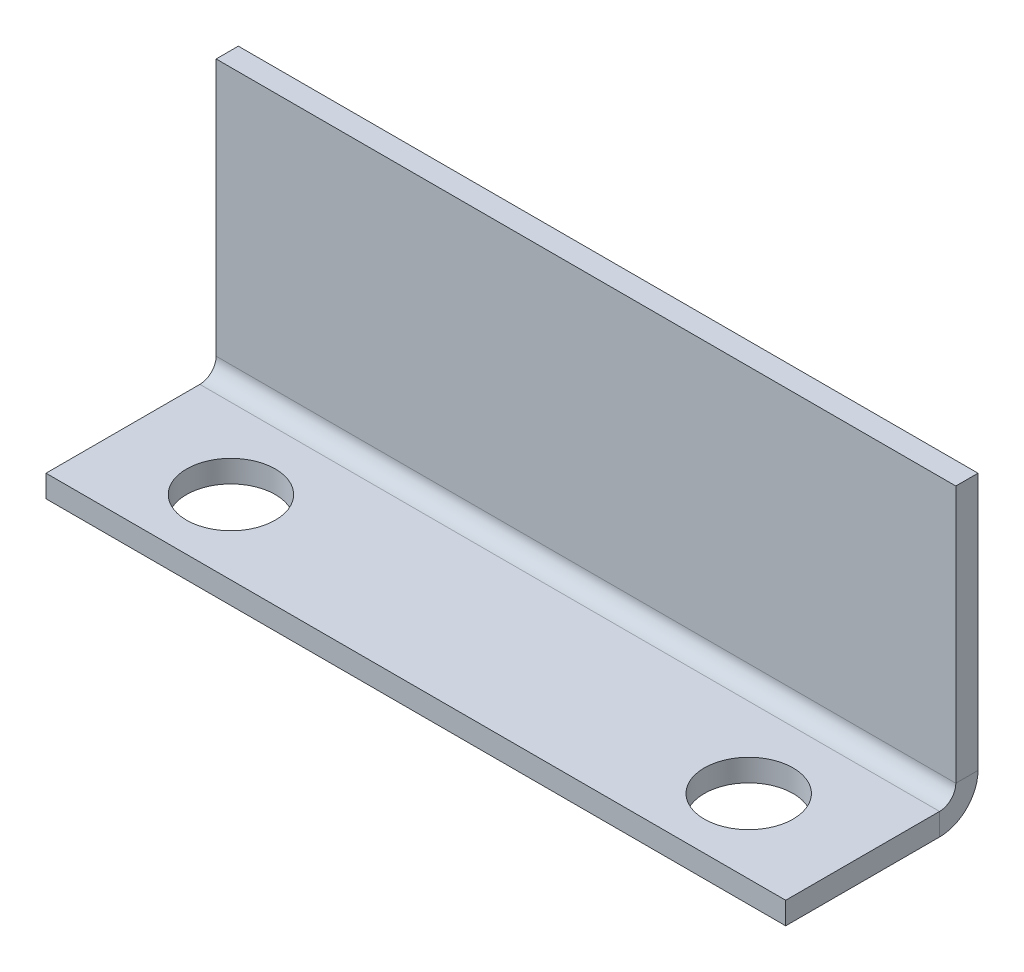
ISO-10303-21;
HEADER;
FILE_DESCRIPTION(('STEP AP214'),'2;1');
FILE_NAME('part.step','',(''),(''),'','','');
FILE_SCHEMA(('AUTOMOTIVE_DESIGN { 1 0 10303 214 1 1 1 1 }'));
ENDSEC;
DATA;
#1=APPLICATION_CONTEXT('core data for automotive mechanical design processes');
#2=APPLICATION_PROTOCOL_DEFINITION('international standard','automotive_design',2000,#1);
#3=PRODUCT_CONTEXT('',#1,'mechanical');
#4=PRODUCT('Part','Part','',(#3));
#5=PRODUCT_RELATED_PRODUCT_CATEGORY('part','',(#4));
#6=PRODUCT_DEFINITION_FORMATION('','',#4);
#7=PRODUCT_DEFINITION_CONTEXT('part definition',#1,'design');
#8=PRODUCT_DEFINITION('design','',#6,#7);
#9=PRODUCT_DEFINITION_SHAPE('','',#8);
#10=(LENGTH_UNIT() NAMED_UNIT(*) SI_UNIT(.MILLI.,.METRE.));
#11=(NAMED_UNIT(*) PLANE_ANGLE_UNIT() SI_UNIT($,.RADIAN.));
#12=(NAMED_UNIT(*) SI_UNIT($,.STERADIAN.) SOLID_ANGLE_UNIT());
#13=UNCERTAINTY_MEASURE_WITH_UNIT(LENGTH_MEASURE(1.E-05),#10,'distance_accuracy_value','');
#14=(GEOMETRIC_REPRESENTATION_CONTEXT(3) GLOBAL_UNCERTAINTY_ASSIGNED_CONTEXT((#13)) GLOBAL_UNIT_ASSIGNED_CONTEXT((#10,
#11,#12)) REPRESENTATION_CONTEXT('',''));
#15=CARTESIAN_POINT('',(0.,0.,0.));
#16=DIRECTION('',(0.,0.,1.));
#17=DIRECTION('',(1.,0.,0.));
#18=AXIS2_PLACEMENT_3D('',#15,#16,#17);
#19=CARTESIAN_POINT('',(0.,0.,3.));
#20=DIRECTION('',(1.,0.,0.));
#21=DIRECTION('',(0.,0.,-1.));
#22=AXIS2_PLACEMENT_3D('',#19,#20,#21);
#23=PLANE('',#22);
#24=DIRECTION('',(0.,0.,-1.));
#25=VECTOR('',#24,1.);
#26=CARTESIAN_POINT('',(0.,5.19999999999999,3.));
#27=LINE('',#26,#25);
#28=CARTESIAN_POINT('',(0.,5.19999999999999,3.));
#29=VERTEX_POINT('',#28);
#30=CARTESIAN_POINT('',(0.,5.20000000000001,0.));
#31=VERTEX_POINT('',#30);
#32=EDGE_CURVE('E110',#29,#31,#27,.T.);
#33=ORIENTED_EDGE('',*,*,#32,.F.);
#34=DIRECTION('',(0.,-1.,0.));
#35=VECTOR('',#34,1.);
#36=CARTESIAN_POINT('',(0.,0.,3.));
#37=LINE('',#36,#35);
#38=CARTESIAN_POINT('',(0.,40.,3.));
#39=VERTEX_POINT('',#38);
#40=EDGE_CURVE('E99',#39,#29,#37,.T.);
#41=ORIENTED_EDGE('',*,*,#40,.F.);
#42=DIRECTION('',(0.,0.,-1.));
#43=VECTOR('',#42,1.);
#44=CARTESIAN_POINT('',(0.,40.,3.));
#45=LINE('',#44,#43);
#46=CARTESIAN_POINT('',(0.,40.,0.));
#47=VERTEX_POINT('',#46);
#48=EDGE_CURVE('E62',#39,#47,#45,.T.);
#49=ORIENTED_EDGE('',*,*,#48,.T.);
#50=DIRECTION('',(0.,-1.,0.));
#51=VECTOR('',#50,1.);
#52=CARTESIAN_POINT('',(0.,0.,0.));
#53=LINE('',#52,#51);
#54=EDGE_CURVE('E105',#47,#31,#53,.T.);
#55=ORIENTED_EDGE('',*,*,#54,.T.);
#56=EDGE_LOOP('',(#33,#41,#49,#55));
#57=FACE_BOUND('',#56,.T.);
#58=ADVANCED_FACE('F54',(#57),#23,.F.);
#59=CARTESIAN_POINT('',(100.,0.,3.));
#60=DIRECTION('',(-1.,0.,0.));
#61=DIRECTION('',(0.,0.,1.));
#62=AXIS2_PLACEMENT_3D('',#59,#60,#61);
#63=PLANE('',#62);
#64=DIRECTION('',(0.,0.,-1.));
#65=VECTOR('',#64,1.);
#66=CARTESIAN_POINT('',(100.,5.19999999999999,3.));
#67=LINE('',#66,#65);
#68=CARTESIAN_POINT('',(100.,5.19999999999999,3.));
#69=VERTEX_POINT('',#68);
#70=CARTESIAN_POINT('',(100.,5.19999999999999,0.));
#71=VERTEX_POINT('',#70);
#72=EDGE_CURVE('E113',#69,#71,#67,.T.);
#73=ORIENTED_EDGE('',*,*,#72,.T.);
#74=DIRECTION('',(0.,1.,0.));
#75=VECTOR('',#74,1.);
#76=CARTESIAN_POINT('',(100.,0.,0.));
#77=LINE('',#76,#75);
#78=CARTESIAN_POINT('',(100.,40.,0.));
#79=VERTEX_POINT('',#78);
#80=EDGE_CURVE('E100',#71,#79,#77,.T.);
#81=ORIENTED_EDGE('',*,*,#80,.T.);
#82=DIRECTION('',(0.,0.,-1.));
#83=VECTOR('',#82,1.);
#84=CARTESIAN_POINT('',(100.,40.,3.));
#85=LINE('',#84,#83);
#86=CARTESIAN_POINT('',(100.,40.,3.));
#87=VERTEX_POINT('',#86);
#88=EDGE_CURVE('E13',#87,#79,#85,.T.);
#89=ORIENTED_EDGE('',*,*,#88,.F.);
#90=DIRECTION('',(0.,1.,0.));
#91=VECTOR('',#90,1.);
#92=CARTESIAN_POINT('',(100.,0.,3.));
#93=LINE('',#92,#91);
#94=EDGE_CURVE('E181',#69,#87,#93,.T.);
#95=ORIENTED_EDGE('',*,*,#94,.F.);
#96=EDGE_LOOP('',(#73,#81,#89,#95));
#97=FACE_BOUND('',#96,.T.);
#98=ADVANCED_FACE('F187',(#97),#63,.F.);
#99=CARTESIAN_POINT('',(0.,40.,3.));
#100=DIRECTION('',(0.,0.,-1.));
#101=DIRECTION('',(-1.,0.,0.));
#102=AXIS2_PLACEMENT_3D('',#99,#100,#101);
#103=PLANE('',#102);
#104=DIRECTION('',(1.,0.,0.));
#105=VECTOR('',#104,1.);
#106=CARTESIAN_POINT('',(100.,5.19999999999999,3.));
#107=LINE('',#106,#105);
#108=EDGE_CURVE('E174',#69,#29,#107,.F.);
#109=ORIENTED_EDGE('',*,*,#108,.F.);
#110=ORIENTED_EDGE('',*,*,#94,.T.);
#111=DIRECTION('',(-1.,0.,0.));
#112=VECTOR('',#111,1.);
#113=CARTESIAN_POINT('',(0.,40.,3.));
#114=LINE('',#113,#112);
#115=EDGE_CURVE('E79',#87,#39,#114,.T.);
#116=ORIENTED_EDGE('',*,*,#115,.T.);
#117=ORIENTED_EDGE('',*,*,#40,.T.);
#118=EDGE_LOOP('',(#109,#110,#116,#117));
#119=FACE_BOUND('',#118,.T.);
#120=ADVANCED_FACE('F184',(#119),#103,.F.);
#121=CARTESIAN_POINT('',(0.,40.,0.));
#122=DIRECTION('',(0.,0.,-1.));
#123=DIRECTION('',(-1.,0.,0.));
#124=AXIS2_PLACEMENT_3D('',#121,#122,#123);
#125=PLANE('',#124);
#126=ORIENTED_EDGE('',*,*,#80,.F.);
#127=DIRECTION('',(1.,0.,0.));
#128=VECTOR('',#127,1.);
#129=CARTESIAN_POINT('',(100.,5.19999999999999,0.));
#130=LINE('',#129,#128);
#131=EDGE_CURVE('E109',#71,#31,#130,.F.);
#132=ORIENTED_EDGE('',*,*,#131,.T.);
#133=ORIENTED_EDGE('',*,*,#54,.F.);
#134=DIRECTION('',(-1.,0.,0.));
#135=VECTOR('',#134,1.);
#136=CARTESIAN_POINT('',(0.,40.,0.));
#137=LINE('',#136,#135);
#138=EDGE_CURVE('E91',#79,#47,#137,.T.);
#139=ORIENTED_EDGE('',*,*,#138,.F.);
#140=EDGE_LOOP('',(#126,#132,#133,#139));
#141=FACE_BOUND('',#140,.T.);
#142=ADVANCED_FACE('F108',(#141),#125,.T.);
#143=CARTESIAN_POINT('',(0.,40.,3.));
#144=DIRECTION('',(0.,-1.,0.));
#145=DIRECTION('',(0.,0.,-1.));
#146=AXIS2_PLACEMENT_3D('',#143,#144,#145);
#147=PLANE('',#146);
#148=ORIENTED_EDGE('',*,*,#138,.T.);
#149=ORIENTED_EDGE('',*,*,#48,.F.);
#150=ORIENTED_EDGE('',*,*,#115,.F.);
#151=ORIENTED_EDGE('',*,*,#88,.T.);
#152=EDGE_LOOP('',(#148,#149,#150,#151));
#153=FACE_BOUND('',#152,.T.);
#154=ADVANCED_FACE('F93',(#153),#147,.F.);
#155=CARTESIAN_POINT('',(0.,5.19999999999999,5.2));
#156=DIRECTION('',(-1.,0.,0.));
#157=DIRECTION('',(0.,0.,1.));
#158=AXIS2_PLACEMENT_3D('',#155,#156,#157);
#159=PLANE('',#158);
#160=DIRECTION('',(0.,1.,0.));
#161=VECTOR('',#160,1.);
#162=CARTESIAN_POINT('',(0.,0.,5.19999999999998));
#163=LINE('',#162,#161);
#164=CARTESIAN_POINT('',(0.,2.99999999999999,5.19999999999999));
#165=VERTEX_POINT('',#164);
#166=CARTESIAN_POINT('',(0.,0.,5.19999999999998));
#167=VERTEX_POINT('',#166);
#168=EDGE_CURVE('E119',#165,#167,#163,.F.);
#169=ORIENTED_EDGE('',*,*,#168,.F.);
#170=CARTESIAN_POINT('',(0.,5.19999999999999,5.2));
#171=DIRECTION('',(1.,0.,0.));
#172=DIRECTION('',(0.,0.,-1.));
#173=AXIS2_PLACEMENT_3D('',#170,#171,#172);
#174=CIRCLE('',#173,2.2);
#175=EDGE_CURVE('E171',#29,#165,#174,.F.);
#176=ORIENTED_EDGE('',*,*,#175,.F.);
#177=ORIENTED_EDGE('',*,*,#32,.T.);
#178=CARTESIAN_POINT('',(0.,5.19999999999999,5.2));
#179=DIRECTION('',(1.,0.,0.));
#180=DIRECTION('',(0.,0.,-1.));
#181=AXIS2_PLACEMENT_3D('',#178,#179,#180);
#182=CIRCLE('',#181,5.2);
#183=EDGE_CURVE('E70',#31,#167,#182,.F.);
#184=ORIENTED_EDGE('',*,*,#183,.T.);
#185=EDGE_LOOP('',(#169,#176,#177,#184));
#186=FACE_BOUND('',#185,.T.);
#187=ADVANCED_FACE('F239',(#186),#159,.T.);
#188=CARTESIAN_POINT('',(100.,5.19999999999999,5.2));
#189=DIRECTION('',(-1.,0.,0.));
#190=DIRECTION('',(0.,0.,1.));
#191=AXIS2_PLACEMENT_3D('',#188,#189,#190);
#192=PLANE('',#191);
#193=CARTESIAN_POINT('',(100.,5.19999999999999,5.2));
#194=DIRECTION('',(1.,0.,0.));
#195=DIRECTION('',(0.,0.,-1.));
#196=AXIS2_PLACEMENT_3D('',#193,#194,#195);
#197=CIRCLE('',#196,2.2);
#198=CARTESIAN_POINT('',(100.,2.99999999999999,5.19999999999999));
#199=VERTEX_POINT('',#198);
#200=EDGE_CURVE('E137',#199,#69,#197,.T.);
#201=ORIENTED_EDGE('',*,*,#200,.F.);
#202=DIRECTION('',(0.,1.,0.));
#203=VECTOR('',#202,1.);
#204=CARTESIAN_POINT('',(100.,2.99999999999999,5.19999999999999));
#205=LINE('',#204,#203);
#206=CARTESIAN_POINT('',(100.,0.,5.19999999999998));
#207=VERTEX_POINT('',#206);
#208=EDGE_CURVE('E161',#199,#207,#205,.F.);
#209=ORIENTED_EDGE('',*,*,#208,.T.);
#210=CARTESIAN_POINT('',(100.,5.19999999999999,5.2));
#211=DIRECTION('',(1.,0.,0.));
#212=DIRECTION('',(0.,0.,-1.));
#213=AXIS2_PLACEMENT_3D('',#210,#211,#212);
#214=CIRCLE('',#213,5.2);
#215=EDGE_CURVE('E167',#207,#71,#214,.T.);
#216=ORIENTED_EDGE('',*,*,#215,.T.);
#217=ORIENTED_EDGE('',*,*,#72,.F.);
#218=EDGE_LOOP('',(#201,#209,#216,#217));
#219=FACE_BOUND('',#218,.T.);
#220=ADVANCED_FACE('F212',(#219),#192,.F.);
#221=CARTESIAN_POINT('',(100.,5.19999999999999,5.2));
#222=DIRECTION('',(1.,0.,0.));
#223=DIRECTION('',(0.,-1.,0.));
#224=AXIS2_PLACEMENT_3D('',#221,#222,#223);
#225=CYLINDRICAL_SURFACE('',#224,5.2);
#226=ORIENTED_EDGE('',*,*,#131,.F.);
#227=ORIENTED_EDGE('',*,*,#215,.F.);
#228=DIRECTION('',(1.,0.,0.));
#229=VECTOR('',#228,1.);
#230=CARTESIAN_POINT('',(0.,0.,5.19999999999998));
#231=LINE('',#230,#229);
#232=EDGE_CURVE('E159',#207,#167,#231,.F.);
#233=ORIENTED_EDGE('',*,*,#232,.T.);
#234=ORIENTED_EDGE('',*,*,#183,.F.);
#235=EDGE_LOOP('',(#226,#227,#233,#234));
#236=FACE_BOUND('',#235,.T.);
#237=ADVANCED_FACE('F237',(#236),#225,.T.);
#238=CARTESIAN_POINT('',(100.,5.19999999999999,5.2));
#239=DIRECTION('',(1.,0.,0.));
#240=DIRECTION('',(0.,-1.,0.));
#241=AXIS2_PLACEMENT_3D('',#238,#239,#240);
#242=CYLINDRICAL_SURFACE('',#241,2.2);
#243=ORIENTED_EDGE('',*,*,#108,.T.);
#244=ORIENTED_EDGE('',*,*,#175,.T.);
#245=DIRECTION('',(1.,0.,0.));
#246=VECTOR('',#245,1.);
#247=CARTESIAN_POINT('',(0.,2.99999999999999,5.19999999999999));
#248=LINE('',#247,#246);
#249=EDGE_CURVE('E124',#165,#199,#248,.T.);
#250=ORIENTED_EDGE('',*,*,#249,.T.);
#251=ORIENTED_EDGE('',*,*,#200,.T.);
#252=EDGE_LOOP('',(#243,#244,#250,#251));
#253=FACE_BOUND('',#252,.T.);
#254=ADVANCED_FACE('F205',(#253),#242,.F.);
#255=CARTESIAN_POINT('',(0.,0.,2.99999999999999));
#256=DIRECTION('',(1.,0.,0.));
#257=DIRECTION('',(0.,0.,-1.));
#258=AXIS2_PLACEMENT_3D('',#255,#256,#257);
#259=PLANE('',#258);
#260=ORIENTED_EDGE('',*,*,#168,.T.);
#261=DIRECTION('',(0.,0.,-1.));
#262=VECTOR('',#261,1.);
#263=CARTESIAN_POINT('',(0.,0.,26.));
#264=LINE('',#263,#262);
#265=CARTESIAN_POINT('',(0.,0.,26.));
#266=VERTEX_POINT('',#265);
#267=EDGE_CURVE('E147',#266,#167,#264,.T.);
#268=ORIENTED_EDGE('',*,*,#267,.F.);
#269=DIRECTION('',(0.,1.,0.));
#270=VECTOR('',#269,1.);
#271=CARTESIAN_POINT('',(0.,0.,26.));
#272=LINE('',#271,#270);
#273=CARTESIAN_POINT('',(0.,2.99999999999992,26.));
#274=VERTEX_POINT('',#273);
#275=EDGE_CURVE('E138',#266,#274,#272,.T.);
#276=ORIENTED_EDGE('',*,*,#275,.T.);
#277=DIRECTION('',(0.,0.,1.));
#278=VECTOR('',#277,1.);
#279=CARTESIAN_POINT('',(0.,3.,3.));
#280=LINE('',#279,#278);
#281=EDGE_CURVE('E156',#274,#165,#280,.F.);
#282=ORIENTED_EDGE('',*,*,#281,.T.);
#283=EDGE_LOOP('',(#260,#268,#276,#282));
#284=FACE_BOUND('',#283,.T.);
#285=ADVANCED_FACE('F232',(#284),#259,.F.);
#286=CARTESIAN_POINT('',(100.,0.,26.));
#287=DIRECTION('',(-1.,0.,0.));
#288=DIRECTION('',(0.,0.,1.));
#289=AXIS2_PLACEMENT_3D('',#286,#287,#288);
#290=PLANE('',#289);
#291=ORIENTED_EDGE('',*,*,#208,.F.);
#292=DIRECTION('',(0.,0.,-1.));
#293=VECTOR('',#292,1.);
#294=CARTESIAN_POINT('',(100.,2.99999999999992,26.));
#295=LINE('',#294,#293);
#296=CARTESIAN_POINT('',(100.,2.99999999999992,26.));
#297=VERTEX_POINT('',#296);
#298=EDGE_CURVE('E153',#199,#297,#295,.F.);
#299=ORIENTED_EDGE('',*,*,#298,.T.);
#300=DIRECTION('',(0.,1.,0.));
#301=VECTOR('',#300,1.);
#302=CARTESIAN_POINT('',(100.,0.,26.));
#303=LINE('',#302,#301);
#304=CARTESIAN_POINT('',(100.,0.,26.));
#305=VERTEX_POINT('',#304);
#306=EDGE_CURVE('E134',#305,#297,#303,.T.);
#307=ORIENTED_EDGE('',*,*,#306,.F.);
#308=DIRECTION('',(0.,0.,1.));
#309=VECTOR('',#308,1.);
#310=CARTESIAN_POINT('',(100.,0.,26.));
#311=LINE('',#310,#309);
#312=EDGE_CURVE('E144',#207,#305,#311,.T.);
#313=ORIENTED_EDGE('',*,*,#312,.F.);
#314=EDGE_LOOP('',(#291,#299,#307,#313));
#315=FACE_BOUND('',#314,.T.);
#316=ADVANCED_FACE('F217',(#315),#290,.F.);
#317=CARTESIAN_POINT('',(0.,0.,26.));
#318=DIRECTION('',(0.,1.,0.));
#319=DIRECTION('',(0.,0.,1.));
#320=AXIS2_PLACEMENT_3D('',#317,#318,#319);
#321=PLANE('',#320);
#322=CARTESIAN_POINT('',(15.,0.,16.));
#323=DIRECTION('',(0.,-1.,0.));
#324=DIRECTION('',(0.,0.,-1.));
#325=AXIS2_PLACEMENT_3D('',#322,#323,#324);
#326=CIRCLE('',#325,6.);
#327=CARTESIAN_POINT('',(15.,0.,10.));
#328=VERTEX_POINT('',#327);
#329=EDGE_CURVE('E131',#328,#328,#326,.T.);
#330=ORIENTED_EDGE('',*,*,#329,.F.);
#331=EDGE_LOOP('',(#330));
#332=FACE_BOUND('',#331,.T.);
#333=CARTESIAN_POINT('',(85.,0.,16.));
#334=DIRECTION('',(0.,-1.,0.));
#335=DIRECTION('',(0.,0.,-1.));
#336=AXIS2_PLACEMENT_3D('',#333,#334,#335);
#337=CIRCLE('',#336,6.);
#338=CARTESIAN_POINT('',(85.,0.,9.99999999999999));
#339=VERTEX_POINT('',#338);
#340=EDGE_CURVE('E120',#339,#339,#337,.T.);
#341=ORIENTED_EDGE('',*,*,#340,.F.);
#342=EDGE_LOOP('',(#341));
#343=FACE_BOUND('',#342,.T.);
#344=ORIENTED_EDGE('',*,*,#232,.F.);
#345=ORIENTED_EDGE('',*,*,#312,.T.);
#346=DIRECTION('',(-1.,0.,0.));
#347=VECTOR('',#346,1.);
#348=CARTESIAN_POINT('',(0.,0.,26.));
#349=LINE('',#348,#347);
#350=EDGE_CURVE('E141',#305,#266,#349,.T.);
#351=ORIENTED_EDGE('',*,*,#350,.T.);
#352=ORIENTED_EDGE('',*,*,#267,.T.);
#353=EDGE_LOOP('',(#344,#345,#351,#352));
#354=FACE_BOUND('',#353,.T.);
#355=ADVANCED_FACE('F235',(#332,#343,#354),#321,.F.);
#356=CARTESIAN_POINT('',(0.,2.99999999999992,26.));
#357=DIRECTION('',(0.,1.,0.));
#358=DIRECTION('',(0.,0.,1.));
#359=AXIS2_PLACEMENT_3D('',#356,#357,#358);
#360=PLANE('',#359);
#361=CARTESIAN_POINT('',(15.,2.99999999999995,16.));
#362=DIRECTION('',(0.,1.,0.));
#363=DIRECTION('',(0.,0.,1.));
#364=AXIS2_PLACEMENT_3D('',#361,#362,#363);
#365=CIRCLE('',#364,6.);
#366=CARTESIAN_POINT('',(15.,2.99999999999993,22.));
#367=VERTEX_POINT('',#366);
#368=EDGE_CURVE('E57',#367,#367,#365,.T.);
#369=ORIENTED_EDGE('',*,*,#368,.F.);
#370=EDGE_LOOP('',(#369));
#371=FACE_BOUND('',#370,.T.);
#372=CARTESIAN_POINT('',(85.,2.99999999999995,16.));
#373=DIRECTION('',(0.,1.,0.));
#374=DIRECTION('',(0.,0.,1.));
#375=AXIS2_PLACEMENT_3D('',#372,#373,#374);
#376=CIRCLE('',#375,6.);
#377=CARTESIAN_POINT('',(85.,2.99999999999993,22.));
#378=VERTEX_POINT('',#377);
#379=EDGE_CURVE('E117',#378,#378,#376,.T.);
#380=ORIENTED_EDGE('',*,*,#379,.F.);
#381=EDGE_LOOP('',(#380));
#382=FACE_BOUND('',#381,.T.);
#383=ORIENTED_EDGE('',*,*,#298,.F.);
#384=ORIENTED_EDGE('',*,*,#249,.F.);
#385=ORIENTED_EDGE('',*,*,#281,.F.);
#386=DIRECTION('',(1.,0.,0.));
#387=VECTOR('',#386,1.);
#388=CARTESIAN_POINT('',(0.,2.99999999999992,26.));
#389=LINE('',#388,#387);
#390=EDGE_CURVE('E150',#297,#274,#389,.F.);
#391=ORIENTED_EDGE('',*,*,#390,.F.);
#392=EDGE_LOOP('',(#383,#384,#385,#391));
#393=FACE_BOUND('',#392,.T.);
#394=ADVANCED_FACE('F221',(#371,#382,#393),#360,.T.);
#395=CARTESIAN_POINT('',(0.,0.,26.));
#396=DIRECTION('',(0.,0.,-1.));
#397=DIRECTION('',(0.,1.,0.));
#398=AXIS2_PLACEMENT_3D('',#395,#396,#397);
#399=PLANE('',#398);
#400=ORIENTED_EDGE('',*,*,#390,.T.);
#401=ORIENTED_EDGE('',*,*,#275,.F.);
#402=ORIENTED_EDGE('',*,*,#350,.F.);
#403=ORIENTED_EDGE('',*,*,#306,.T.);
#404=EDGE_LOOP('',(#400,#401,#402,#403));
#405=FACE_BOUND('',#404,.T.);
#406=ADVANCED_FACE('F226',(#405),#399,.F.);
#407=CARTESIAN_POINT('',(85.,9.99999999999994,16.));
#408=DIRECTION('',(0.,-1.,0.));
#409=DIRECTION('',(0.,0.,-1.));
#410=AXIS2_PLACEMENT_3D('',#407,#408,#409);
#411=CYLINDRICAL_SURFACE('',#410,6.);
#412=ORIENTED_EDGE('',*,*,#379,.T.);
#413=EDGE_LOOP('',(#412));
#414=FACE_BOUND('',#413,.T.);
#415=ORIENTED_EDGE('',*,*,#340,.T.);
#416=EDGE_LOOP('',(#415));
#417=FACE_BOUND('',#416,.T.);
#418=ADVANCED_FACE('F371',(#414,#417),#411,.F.);
#419=CARTESIAN_POINT('',(15.,9.99999999999994,16.0000000000001));
#420=DIRECTION('',(0.,-1.,0.));
#421=DIRECTION('',(0.,0.,-1.));
#422=AXIS2_PLACEMENT_3D('',#419,#420,#421);
#423=CYLINDRICAL_SURFACE('',#422,6.);
#424=ORIENTED_EDGE('',*,*,#368,.T.);
#425=EDGE_LOOP('',(#424));
#426=FACE_BOUND('',#425,.T.);
#427=ORIENTED_EDGE('',*,*,#329,.T.);
#428=EDGE_LOOP('',(#427));
#429=FACE_BOUND('',#428,.T.);
#430=ADVANCED_FACE('F380',(#426,#429),#423,.F.);
#431=CLOSED_SHELL('',(#58,#98,#120,#142,#154,#187,#220,#237,#254,#285,#316,#355,#394,#406,#418,#430));
#432=MANIFOLD_SOLID_BREP('B2',#431);
#433=ADVANCED_BREP_SHAPE_REPRESENTATION('',(#18,#432),#14);
#434=SHAPE_DEFINITION_REPRESENTATION(#9,#433);
ENDSEC;
END-ISO-10303-21;
